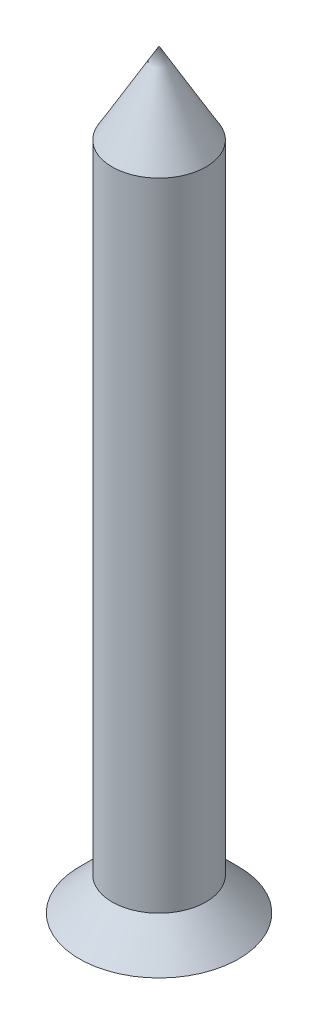
ISO-10303-21;
HEADER;
FILE_DESCRIPTION(('STEP AP214'),'2;1');
FILE_NAME('part.step','',(''),(''),'','','');
FILE_SCHEMA(('AUTOMOTIVE_DESIGN { 1 0 10303 214 1 1 1 1 }'));
ENDSEC;
DATA;
#1=APPLICATION_CONTEXT('core data for automotive mechanical design processes');
#2=APPLICATION_PROTOCOL_DEFINITION('international standard','automotive_design',2000,#1);
#3=PRODUCT_CONTEXT('',#1,'mechanical');
#4=PRODUCT('Part','Part','',(#3));
#5=PRODUCT_RELATED_PRODUCT_CATEGORY('part','',(#4));
#6=PRODUCT_DEFINITION_FORMATION('','',#4);
#7=PRODUCT_DEFINITION_CONTEXT('part definition',#1,'design');
#8=PRODUCT_DEFINITION('design','',#6,#7);
#9=PRODUCT_DEFINITION_SHAPE('','',#8);
#10=(LENGTH_UNIT() NAMED_UNIT(*) SI_UNIT(.MILLI.,.METRE.));
#11=(NAMED_UNIT(*) PLANE_ANGLE_UNIT() SI_UNIT($,.RADIAN.));
#12=(NAMED_UNIT(*) SI_UNIT($,.STERADIAN.) SOLID_ANGLE_UNIT());
#13=UNCERTAINTY_MEASURE_WITH_UNIT(LENGTH_MEASURE(1.E-05),#10,'distance_accuracy_value','');
#14=(GEOMETRIC_REPRESENTATION_CONTEXT(3) GLOBAL_UNCERTAINTY_ASSIGNED_CONTEXT((#13)) GLOBAL_UNIT_ASSIGNED_CONTEXT((#10,
#11,#12)) REPRESENTATION_CONTEXT('',''));
#15=CARTESIAN_POINT('',(0.,0.,0.));
#16=DIRECTION('',(0.,0.,1.));
#17=DIRECTION('',(1.,0.,0.));
#18=AXIS2_PLACEMENT_3D('',#15,#16,#17);
#19=CARTESIAN_POINT('',(0.,1.,0.));
#20=DIRECTION('',(0.,-1.,0.));
#21=DIRECTION('',(0.,0.,-1.));
#22=AXIS2_PLACEMENT_3D('',#19,#20,#21);
#23=PLANE('',#22);
#24=DIRECTION('',(-0.866025403784439,0.,-0.5));
#25=VECTOR('',#24,1.);
#26=CARTESIAN_POINT('',(0.,1.,-0.692820323027551));
#27=LINE('',#26,#25);
#28=CARTESIAN_POINT('',(0.,1.,-0.692820323027551));
#29=VERTEX_POINT('',#28);
#30=CARTESIAN_POINT('',(0.6,1.,-0.346410161513776));
#31=VERTEX_POINT('',#30);
#32=EDGE_CURVE('E88',#29,#31,#27,.F.);
#33=ORIENTED_EDGE('',*,*,#32,.T.);
#34=DIRECTION('',(0.,0.,-1.));
#35=VECTOR('',#34,1.);
#36=CARTESIAN_POINT('',(0.6,1.,-0.346410161513776));
#37=LINE('',#36,#35);
#38=CARTESIAN_POINT('',(0.6,1.,0.346410161513776));
#39=VERTEX_POINT('',#38);
#40=EDGE_CURVE('E95',#31,#39,#37,.F.);
#41=ORIENTED_EDGE('',*,*,#40,.T.);
#42=DIRECTION('',(0.866025403784439,0.,-0.5));
#43=VECTOR('',#42,1.);
#44=CARTESIAN_POINT('',(0.6,1.,0.346410161513776));
#45=LINE('',#44,#43);
#46=CARTESIAN_POINT('',(0.,1.,0.692820323027551));
#47=VERTEX_POINT('',#46);
#48=EDGE_CURVE('E100',#39,#47,#45,.F.);
#49=ORIENTED_EDGE('',*,*,#48,.T.);
#50=DIRECTION('',(0.866025403784439,0.,0.5));
#51=VECTOR('',#50,1.);
#52=CARTESIAN_POINT('',(0.,1.,0.692820323027551));
#53=LINE('',#52,#51);
#54=CARTESIAN_POINT('',(-0.6,1.,0.346410161513776));
#55=VERTEX_POINT('',#54);
#56=EDGE_CURVE('E72',#47,#55,#53,.F.);
#57=ORIENTED_EDGE('',*,*,#56,.T.);
#58=DIRECTION('',(0.,0.,1.));
#59=VECTOR('',#58,1.);
#60=CARTESIAN_POINT('',(-0.6,1.,0.346410161513776));
#61=LINE('',#60,#59);
#62=CARTESIAN_POINT('',(-0.6,1.,-0.346410161513776));
#63=VERTEX_POINT('',#62);
#64=EDGE_CURVE('E69',#55,#63,#61,.F.);
#65=ORIENTED_EDGE('',*,*,#64,.T.);
#66=DIRECTION('',(-0.866025403784439,0.,0.5));
#67=VECTOR('',#66,1.);
#68=CARTESIAN_POINT('',(-0.6,1.,-0.346410161513776));
#69=LINE('',#68,#67);
#70=EDGE_CURVE('E66',#63,#29,#69,.F.);
#71=ORIENTED_EDGE('',*,*,#70,.T.);
#72=EDGE_LOOP('',(#33,#41,#49,#57,#65,#71));
#73=FACE_BOUND('',#72,.T.);
#74=ADVANCED_FACE('F17',(#73),#23,.T.);
#75=CARTESIAN_POINT('',(-0.6,1.,0.346410161513776));
#76=DIRECTION('',(-1.,0.,0.));
#77=DIRECTION('',(0.,0.,1.));
#78=AXIS2_PLACEMENT_3D('',#75,#76,#77);
#79=PLANE('',#78);
#80=DIRECTION('',(0.,1.,0.));
#81=VECTOR('',#80,1.);
#82=CARTESIAN_POINT('',(-0.6,1.,-0.346410161513776));
#83=LINE('',#82,#81);
#84=CARTESIAN_POINT('',(-0.6,0.,-0.346410161513776));
#85=VERTEX_POINT('',#84);
#86=EDGE_CURVE('E75',#85,#63,#83,.T.);
#87=ORIENTED_EDGE('',*,*,#86,.T.);
#88=ORIENTED_EDGE('',*,*,#64,.F.);
#89=DIRECTION('',(0.,1.,0.));
#90=VECTOR('',#89,1.);
#91=CARTESIAN_POINT('',(-0.6,1.,0.346410161513776));
#92=LINE('',#91,#90);
#93=CARTESIAN_POINT('',(-0.6,0.,0.346410161513776));
#94=VERTEX_POINT('',#93);
#95=EDGE_CURVE('E106',#55,#94,#92,.F.);
#96=ORIENTED_EDGE('',*,*,#95,.T.);
#97=DIRECTION('',(0.,0.,1.));
#98=VECTOR('',#97,1.);
#99=CARTESIAN_POINT('',(-0.6,0.,0.));
#100=LINE('',#99,#98);
#101=EDGE_CURVE('E79',#94,#85,#100,.F.);
#102=ORIENTED_EDGE('',*,*,#101,.T.);
#103=EDGE_LOOP('',(#87,#88,#96,#102));
#104=FACE_BOUND('',#103,.T.);
#105=ADVANCED_FACE('F77',(#104),#79,.F.);
#106=CARTESIAN_POINT('',(-0.6,1.,-0.346410161513776));
#107=DIRECTION('',(-0.5,0.,-0.866025403784439));
#108=DIRECTION('',(-0.866025403784439,0.,0.5));
#109=AXIS2_PLACEMENT_3D('',#106,#107,#108);
#110=PLANE('',#109);
#111=DIRECTION('',(0.,1.,0.));
#112=VECTOR('',#111,1.);
#113=CARTESIAN_POINT('',(0.,1.,-0.692820323027551));
#114=LINE('',#113,#112);
#115=CARTESIAN_POINT('',(0.,0.,-0.692820323027551));
#116=VERTEX_POINT('',#115);
#117=EDGE_CURVE('E85',#116,#29,#114,.T.);
#118=ORIENTED_EDGE('',*,*,#117,.T.);
#119=ORIENTED_EDGE('',*,*,#70,.F.);
#120=ORIENTED_EDGE('',*,*,#86,.F.);
#121=DIRECTION('',(0.866025403784438,0.,-0.5));
#122=VECTOR('',#121,1.);
#123=CARTESIAN_POINT('',(-0.6,0.,-0.346410161513776));
#124=LINE('',#123,#122);
#125=EDGE_CURVE('E111',#85,#116,#124,.T.);
#126=ORIENTED_EDGE('',*,*,#125,.T.);
#127=EDGE_LOOP('',(#118,#119,#120,#126));
#128=FACE_BOUND('',#127,.T.);
#129=ADVANCED_FACE('F83',(#128),#110,.F.);
#130=CARTESIAN_POINT('',(0.,1.,-0.692820323027551));
#131=DIRECTION('',(0.5,0.,-0.866025403784439));
#132=DIRECTION('',(-0.866025403784439,0.,-0.5));
#133=AXIS2_PLACEMENT_3D('',#130,#131,#132);
#134=PLANE('',#133);
#135=DIRECTION('',(0.,1.,0.));
#136=VECTOR('',#135,1.);
#137=CARTESIAN_POINT('',(0.6,1.,-0.346410161513776));
#138=LINE('',#137,#136);
#139=CARTESIAN_POINT('',(0.6,0.,-0.346410161513776));
#140=VERTEX_POINT('',#139);
#141=EDGE_CURVE('E92',#140,#31,#138,.T.);
#142=ORIENTED_EDGE('',*,*,#141,.T.);
#143=ORIENTED_EDGE('',*,*,#32,.F.);
#144=ORIENTED_EDGE('',*,*,#117,.F.);
#145=DIRECTION('',(0.866025403784439,0.,0.5));
#146=VECTOR('',#145,1.);
#147=CARTESIAN_POINT('',(0.,0.,-0.692820323027551));
#148=LINE('',#147,#146);
#149=EDGE_CURVE('E113',#116,#140,#148,.T.);
#150=ORIENTED_EDGE('',*,*,#149,.T.);
#151=EDGE_LOOP('',(#142,#143,#144,#150));
#152=FACE_BOUND('',#151,.T.);
#153=ADVANCED_FACE('F206',(#152),#134,.F.);
#154=CARTESIAN_POINT('',(0.6,1.,-0.346410161513776));
#155=DIRECTION('',(1.,0.,0.));
#156=DIRECTION('',(0.,0.,-1.));
#157=AXIS2_PLACEMENT_3D('',#154,#155,#156);
#158=PLANE('',#157);
#159=DIRECTION('',(0.,1.,0.));
#160=VECTOR('',#159,1.);
#161=CARTESIAN_POINT('',(0.6,1.,0.346410161513776));
#162=LINE('',#161,#160);
#163=CARTESIAN_POINT('',(0.6,0.,0.346410161513776));
#164=VERTEX_POINT('',#163);
#165=EDGE_CURVE('E97',#164,#39,#162,.T.);
#166=ORIENTED_EDGE('',*,*,#165,.T.);
#167=ORIENTED_EDGE('',*,*,#40,.F.);
#168=ORIENTED_EDGE('',*,*,#141,.F.);
#169=DIRECTION('',(0.,0.,1.));
#170=VECTOR('',#169,1.);
#171=CARTESIAN_POINT('',(0.6,0.,0.));
#172=LINE('',#171,#170);
#173=EDGE_CURVE('E115',#140,#164,#172,.T.);
#174=ORIENTED_EDGE('',*,*,#173,.T.);
#175=EDGE_LOOP('',(#166,#167,#168,#174));
#176=FACE_BOUND('',#175,.T.);
#177=ADVANCED_FACE('F148',(#176),#158,.F.);
#178=CARTESIAN_POINT('',(0.6,1.,0.346410161513776));
#179=DIRECTION('',(0.5,0.,0.866025403784439));
#180=DIRECTION('',(0.866025403784439,0.,-0.5));
#181=AXIS2_PLACEMENT_3D('',#178,#179,#180);
#182=PLANE('',#181);
#183=DIRECTION('',(0.,1.,0.));
#184=VECTOR('',#183,1.);
#185=CARTESIAN_POINT('',(0.,1.,0.692820323027551));
#186=LINE('',#185,#184);
#187=CARTESIAN_POINT('',(0.,0.,0.692820323027551));
#188=VERTEX_POINT('',#187);
#189=EDGE_CURVE('E102',#188,#47,#186,.T.);
#190=ORIENTED_EDGE('',*,*,#189,.T.);
#191=ORIENTED_EDGE('',*,*,#48,.F.);
#192=ORIENTED_EDGE('',*,*,#165,.F.);
#193=DIRECTION('',(-0.866025403784438,0.,0.5));
#194=VECTOR('',#193,1.);
#195=CARTESIAN_POINT('',(0.6,0.,0.346410161513776));
#196=LINE('',#195,#194);
#197=EDGE_CURVE('E117',#164,#188,#196,.T.);
#198=ORIENTED_EDGE('',*,*,#197,.T.);
#199=EDGE_LOOP('',(#190,#191,#192,#198));
#200=FACE_BOUND('',#199,.T.);
#201=ADVANCED_FACE('F140',(#200),#182,.F.);
#202=CARTESIAN_POINT('',(0.,1.,0.692820323027551));
#203=DIRECTION('',(-0.5,0.,0.866025403784439));
#204=DIRECTION('',(0.866025403784439,0.,0.5));
#205=AXIS2_PLACEMENT_3D('',#202,#203,#204);
#206=PLANE('',#205);
#207=ORIENTED_EDGE('',*,*,#95,.F.);
#208=ORIENTED_EDGE('',*,*,#56,.F.);
#209=ORIENTED_EDGE('',*,*,#189,.F.);
#210=DIRECTION('',(-0.866025403784439,0.,-0.5));
#211=VECTOR('',#210,1.);
#212=CARTESIAN_POINT('',(0.,0.,0.692820323027551));
#213=LINE('',#212,#211);
#214=EDGE_CURVE('E119',#188,#94,#213,.T.);
#215=ORIENTED_EDGE('',*,*,#214,.T.);
#216=EDGE_LOOP('',(#207,#208,#209,#215));
#217=FACE_BOUND('',#216,.T.);
#218=ADVANCED_FACE('F133',(#217),#206,.F.);
#219=CARTESIAN_POINT('',(0.,0.,0.));
#220=DIRECTION('',(0.,1.,0.));
#221=DIRECTION('',(0.,0.,1.));
#222=AXIS2_PLACEMENT_3D('',#219,#220,#221);
#223=PLANE('',#222);
#224=CARTESIAN_POINT('',(0.,1.13686837721616E-10,0.));
#225=DIRECTION('',(0.,-1.,0.));
#226=DIRECTION('',(0.,0.,-1.));
#227=AXIS2_PLACEMENT_3D('',#224,#225,#226);
#228=CIRCLE('',#227,1.70000000002801);
#229=CARTESIAN_POINT('',(0.,1.13686837721616E-10,-1.70000000002801));
#230=VERTEX_POINT('',#229);
#231=EDGE_CURVE('E20',#230,#230,#228,.F.);
#232=ORIENTED_EDGE('',*,*,#231,.F.);
#233=EDGE_LOOP('',(#232));
#234=FACE_BOUND('',#233,.T.);
#235=ORIENTED_EDGE('',*,*,#197,.F.);
#236=ORIENTED_EDGE('',*,*,#173,.F.);
#237=ORIENTED_EDGE('',*,*,#149,.F.);
#238=ORIENTED_EDGE('',*,*,#125,.F.);
#239=ORIENTED_EDGE('',*,*,#101,.F.);
#240=ORIENTED_EDGE('',*,*,#214,.F.);
#241=EDGE_LOOP('',(#235,#236,#237,#238,#239,#240));
#242=FACE_BOUND('',#241,.T.);
#243=ADVANCED_FACE('F130',(#234,#242),#223,.F.);
#244=CARTESIAN_POINT('',(0.,1.70530256582424E-10,0.));
#245=DIRECTION('',(0.,-1.,0.));
#246=DIRECTION('',(0.,0.,-1.));
#247=AXIS2_PLACEMENT_3D('',#244,#245,#246);
#248=CONICAL_SURFACE('',#247,1.69999999997117,0.785398163397448);
#249=ORIENTED_EDGE('',*,*,#231,.T.);
#250=EDGE_LOOP('',(#249));
#251=FACE_BOUND('',#250,.T.);
#252=CARTESIAN_POINT('',(0.,0.699999999999992,0.));
#253=DIRECTION('',(0.,1.,0.));
#254=DIRECTION('',(0.,0.,1.));
#255=AXIS2_PLACEMENT_3D('',#252,#253,#254);
#256=CIRCLE('',#255,1.);
#257=CARTESIAN_POINT('',(0.,0.699999999999992,1.));
#258=VERTEX_POINT('',#257);
#259=EDGE_CURVE('E26',#258,#258,#256,.T.);
#260=ORIENTED_EDGE('',*,*,#259,.F.);
#261=EDGE_LOOP('',(#260));
#262=FACE_BOUND('',#261,.T.);
#263=ADVANCED_FACE('F127',(#251,#262),#248,.T.);
#264=CARTESIAN_POINT('',(0.,14.2679491924014,0.));
#265=DIRECTION('',(0.,-1.,0.));
#266=DIRECTION('',(0.,0.,-1.));
#267=AXIS2_PLACEMENT_3D('',#264,#265,#266);
#268=CONICAL_SURFACE('',#267,1.0000000000332,0.523598775547312);
#269=CARTESIAN_POINT('',(0.,16.0000000000764,2.8421709430404E-11));
#270=VERTEX_POINT('',#269);
#271=VERTEX_LOOP('',#270);
#272=FACE_BOUND('',#271,.T.);
#273=CARTESIAN_POINT('',(0.,14.2679491924311,0.));
#274=DIRECTION('',(0.,1.,0.));
#275=DIRECTION('',(0.,0.,1.));
#276=AXIS2_PLACEMENT_3D('',#273,#274,#275);
#277=CIRCLE('',#276,1.);
#278=CARTESIAN_POINT('',(0.,14.2679491924311,1.));
#279=VERTEX_POINT('',#278);
#280=EDGE_CURVE('E10',#279,#279,#277,.F.);
#281=ORIENTED_EDGE('',*,*,#280,.F.);
#282=EDGE_LOOP('',(#281));
#283=FACE_BOUND('',#282,.T.);
#284=ADVANCED_FACE('F152',(#272,#283),#268,.T.);
#285=CARTESIAN_POINT('',(0.,0.,0.));
#286=DIRECTION('',(0.,1.,0.));
#287=DIRECTION('',(0.,0.,1.));
#288=AXIS2_PLACEMENT_3D('',#285,#286,#287);
#289=CYLINDRICAL_SURFACE('',#288,1.);
#290=ORIENTED_EDGE('',*,*,#280,.T.);
#291=EDGE_LOOP('',(#290));
#292=FACE_BOUND('',#291,.T.);
#293=ORIENTED_EDGE('',*,*,#259,.T.);
#294=EDGE_LOOP('',(#293));
#295=FACE_BOUND('',#294,.T.);
#296=ADVANCED_FACE('F150',(#292,#295),#289,.T.);
#297=CLOSED_SHELL('',(#74,#105,#129,#153,#177,#201,#218,#243,#263,#284,#296));
#298=MANIFOLD_SOLID_BREP('B1',#297);
#299=ADVANCED_BREP_SHAPE_REPRESENTATION('',(#18,#298),#14);
#300=SHAPE_DEFINITION_REPRESENTATION(#9,#299);
ENDSEC;
END-ISO-10303-21;
